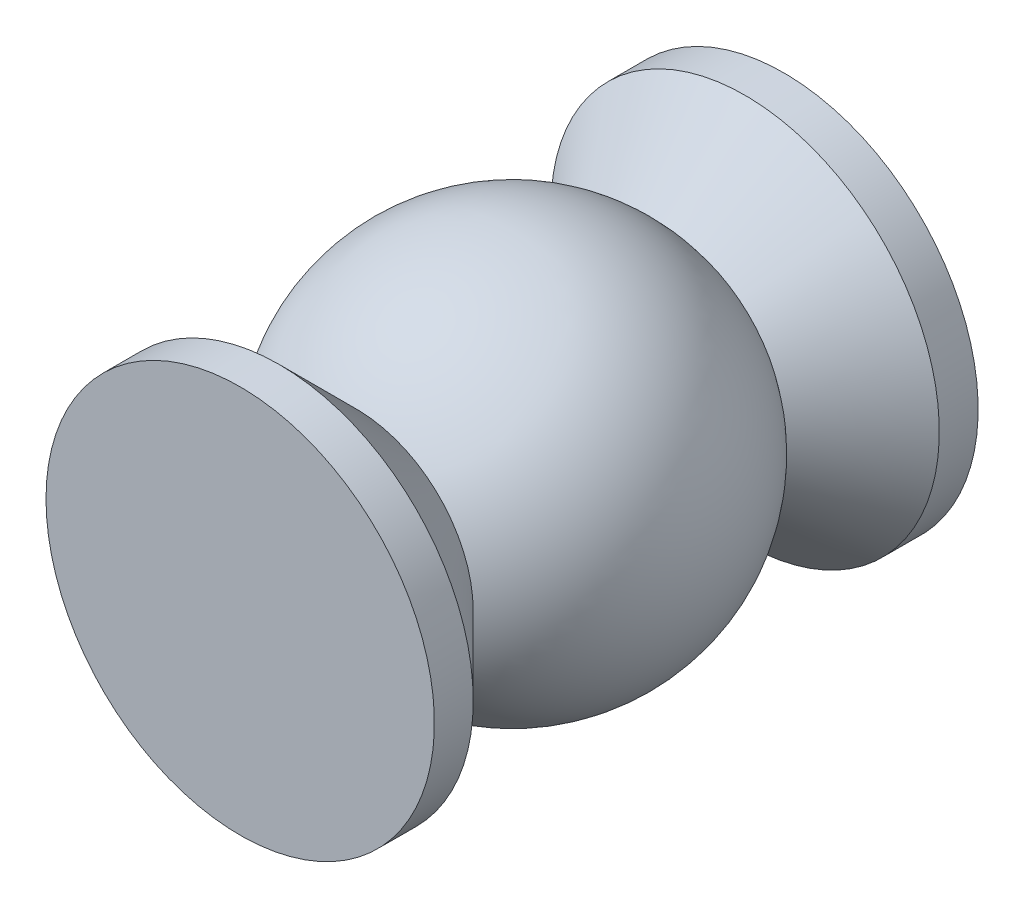
ISO-10303-21;
HEADER;
FILE_DESCRIPTION(('STEP AP214'),'2;1');
FILE_NAME('part.step','',(''),(''),'','','');
FILE_SCHEMA(('AUTOMOTIVE_DESIGN { 1 0 10303 214 1 1 1 1 }'));
ENDSEC;
DATA;
#1=APPLICATION_CONTEXT('core data for automotive mechanical design processes');
#2=APPLICATION_PROTOCOL_DEFINITION('international standard','automotive_design',2000,#1);
#3=PRODUCT_CONTEXT('',#1,'mechanical');
#4=PRODUCT('Part','Part','',(#3));
#5=PRODUCT_RELATED_PRODUCT_CATEGORY('part','',(#4));
#6=PRODUCT_DEFINITION_FORMATION('','',#4);
#7=PRODUCT_DEFINITION_CONTEXT('part definition',#1,'design');
#8=PRODUCT_DEFINITION('design','',#6,#7);
#9=PRODUCT_DEFINITION_SHAPE('','',#8);
#10=(LENGTH_UNIT() NAMED_UNIT(*) SI_UNIT(.MILLI.,.METRE.));
#11=(NAMED_UNIT(*) PLANE_ANGLE_UNIT() SI_UNIT($,.RADIAN.));
#12=(NAMED_UNIT(*) SI_UNIT($,.STERADIAN.) SOLID_ANGLE_UNIT());
#13=UNCERTAINTY_MEASURE_WITH_UNIT(LENGTH_MEASURE(1.E-05),#10,'distance_accuracy_value','');
#14=(GEOMETRIC_REPRESENTATION_CONTEXT(3) GLOBAL_UNCERTAINTY_ASSIGNED_CONTEXT((#13)) GLOBAL_UNIT_ASSIGNED_CONTEXT((#10,
#11,#12)) REPRESENTATION_CONTEXT('',''));
#15=CARTESIAN_POINT('',(0.,0.,0.));
#16=DIRECTION('',(0.,0.,1.));
#17=DIRECTION('',(1.,0.,0.));
#18=AXIS2_PLACEMENT_3D('',#15,#16,#17);
#19=CARTESIAN_POINT('',(0.,0.,-35.));
#20=DIRECTION('',(0.,0.,1.));
#21=DIRECTION('',(1.,0.,0.));
#22=AXIS2_PLACEMENT_3D('',#19,#20,#21);
#23=PLANE('',#22);
#24=CARTESIAN_POINT('',(0.,0.,-35.));
#25=DIRECTION('',(0.,0.,-1.));
#26=DIRECTION('',(-1.,0.,0.));
#27=AXIS2_PLACEMENT_3D('',#24,#25,#26);
#28=CIRCLE('',#27,25.);
#29=CARTESIAN_POINT('',(-25.,0.,-35.));
#30=VERTEX_POINT('',#29);
#31=EDGE_CURVE('E10',#30,#30,#28,.T.);
#32=ORIENTED_EDGE('',*,*,#31,.T.);
#33=EDGE_LOOP('',(#32));
#34=FACE_BOUND('',#33,.T.);
#35=ADVANCED_FACE('F39',(#34),#23,.F.);
#36=CARTESIAN_POINT('',(0.,0.,-35.));
#37=DIRECTION('',(0.,0.,-1.));
#38=DIRECTION('',(-1.,0.,0.));
#39=AXIS2_PLACEMENT_3D('',#36,#37,#38);
#40=CYLINDRICAL_SURFACE('',#39,25.);
#41=ORIENTED_EDGE('',*,*,#31,.F.);
#42=EDGE_LOOP('',(#41));
#43=FACE_BOUND('',#42,.T.);
#44=CARTESIAN_POINT('',(0.,0.,-30.));
#45=DIRECTION('',(0.,0.,-1.));
#46=DIRECTION('',(-1.,0.,0.));
#47=AXIS2_PLACEMENT_3D('',#44,#45,#46);
#48=CIRCLE('',#47,25.);
#49=CARTESIAN_POINT('',(-25.,0.,-30.));
#50=VERTEX_POINT('',#49);
#51=EDGE_CURVE('E45',#50,#50,#48,.T.);
#52=ORIENTED_EDGE('',*,*,#51,.T.);
#53=EDGE_LOOP('',(#52));
#54=FACE_BOUND('',#53,.T.);
#55=ADVANCED_FACE('F77',(#43,#54),#40,.T.);
#56=CARTESIAN_POINT('',(0.,0.,-20.));
#57=DIRECTION('',(0.,0.,-1.));
#58=DIRECTION('',(-1.,0.,0.));
#59=AXIS2_PLACEMENT_3D('',#56,#57,#58);
#60=CONICAL_SURFACE('',#59,15.,0.78539816339745);
#61=ORIENTED_EDGE('',*,*,#51,.F.);
#62=EDGE_LOOP('',(#61));
#63=FACE_BOUND('',#62,.T.);
#64=CARTESIAN_POINT('',(0.,0.,-20.));
#65=DIRECTION('',(0.,0.,-1.));
#66=DIRECTION('',(-1.,0.,0.));
#67=AXIS2_PLACEMENT_3D('',#64,#65,#66);
#68=CIRCLE('',#67,15.);
#69=CARTESIAN_POINT('',(15.,0.,-20.));
#70=VERTEX_POINT('',#69);
#71=EDGE_CURVE('E49',#70,#70,#68,.T.);
#72=ORIENTED_EDGE('',*,*,#71,.T.);
#73=EDGE_LOOP('',(#72));
#74=FACE_BOUND('',#73,.T.);
#75=ADVANCED_FACE('F81',(#63,#74),#60,.T.);
#76=CARTESIAN_POINT('',(0.,0.,0.));
#77=DIRECTION('',(0.,0.,-1.));
#78=DIRECTION('',(1.,0.,0.));
#79=AXIS2_PLACEMENT_3D('',#76,#77,#78);
#80=SPHERICAL_SURFACE('',#79,25.);
#81=CARTESIAN_POINT('',(0.,0.,20.));
#82=DIRECTION('',(0.,0.,-1.));
#83=DIRECTION('',(-1.,0.,0.));
#84=AXIS2_PLACEMENT_3D('',#81,#82,#83);
#85=CIRCLE('',#84,15.);
#86=CARTESIAN_POINT('',(15.,0.,20.));
#87=VERTEX_POINT('',#86);
#88=EDGE_CURVE('E53',#87,#87,#85,.T.);
#89=CARTESIAN_POINT('',(15.,0.,-20.));
#90=CARTESIAN_POINT('',(15.386383877575,0.,-19.7102331585328));
#91=CARTESIAN_POINT('',(15.764349304277,0.,-19.4092445387064));
#92=CARTESIAN_POINT('',(16.5022218904126,0.,-18.785891059142));
#93=CARTESIAN_POINT('',(16.8621290498462,0.,-18.4635261994041));
#94=CARTESIAN_POINT('',(17.5626637359227,0.,-17.7984875568239));
#95=CARTESIAN_POINT('',(17.9032912625655,0.,-17.4558137739817));
#96=CARTESIAN_POINT('',(18.5641263057405,0.,-16.751312031891));
#97=CARTESIAN_POINT('',(18.8843338222725,0.,-16.3894840726425));
#98=CARTESIAN_POINT('',(19.5032526836538,0.,-15.6478878896459));
#99=CARTESIAN_POINT('',(19.8019640285029,0.,-15.2681196658977));
#100=CARTESIAN_POINT('',(20.3768877346254,0.,-14.4919184892619));
#101=CARTESIAN_POINT('',(20.6531000958988,0.,-14.0954855363742));
#102=CARTESIAN_POINT('',(21.1820982609088,0.,-13.2872860261715));
#103=CARTESIAN_POINT('',(21.4348840646453,0.,-12.8755194688565));
#104=CARTESIAN_POINT('',(21.9161802896365,0.,-12.0380354631662));
#105=CARTESIAN_POINT('',(22.1446907108911,0.,-11.6123180147909));
#106=CARTESIAN_POINT('',(22.5766688391047,0.,-10.748361760207));
#107=CARTESIAN_POINT('',(22.7801365460637,0.,-10.3101229539983));
#108=CARTESIAN_POINT('',(23.1613460121235,0.,-9.42259557021362));
#109=CARTESIAN_POINT('',(23.3390877712243,0.,-8.97330699263761));
#110=CARTESIAN_POINT('',(23.6682484928968,0.,-8.06518875528101));
#111=CARTESIAN_POINT('',(23.8196674554685,0.,-7.60635909550044));
#112=CARTESIAN_POINT('',(24.0956741265362,0.,-6.6806994219065));
#113=CARTESIAN_POINT('',(24.2202618350321,0.,-6.21386940809315));
#114=CARTESIAN_POINT('',(24.4421876383544,0.,-5.27377661927491));
#115=CARTESIAN_POINT('',(24.5395257331807,0.,-4.80051384427002));
#116=CARTESIAN_POINT('',(24.706625452501,0.,-3.84914472685123));
#117=CARTESIAN_POINT('',(24.776387076995,0.,-3.37103838443732));
#118=CARTESIAN_POINT('',(24.8880995994487,0.,-2.41158759044098));
#119=CARTESIAN_POINT('',(24.9300504974084,0.,-1.93024313885855));
#120=CARTESIAN_POINT('',(24.986000697684,0.,-0.965932458184076));
#121=CARTESIAN_POINT('',(25.,0.,-0.482966229092036));
#122=CARTESIAN_POINT('',(25.,0.,0.482966229092047));
#123=CARTESIAN_POINT('',(24.986000697684,0.,0.965932458184088));
#124=CARTESIAN_POINT('',(24.9300504974084,0.,1.93024313885856));
#125=CARTESIAN_POINT('',(24.8880995994487,0.,2.41158759044099));
#126=CARTESIAN_POINT('',(24.776387076995,0.,3.37103838443733));
#127=CARTESIAN_POINT('',(24.706625452501,0.,3.84914472685124));
#128=CARTESIAN_POINT('',(24.5395257331807,0.,4.80051384427003));
#129=CARTESIAN_POINT('',(24.4421876383544,0.,5.27377661927492));
#130=CARTESIAN_POINT('',(24.2202618350321,0.,6.21386940809316));
#131=CARTESIAN_POINT('',(24.0956741265362,0.,6.68069942190651));
#132=CARTESIAN_POINT('',(23.8196674554685,0.,7.60635909550045));
#133=CARTESIAN_POINT('',(23.6682484928968,0.,8.06518875528102));
#134=CARTESIAN_POINT('',(23.3390877712243,0.,8.97330699263762));
#135=CARTESIAN_POINT('',(23.1613460121235,0.,9.42259557021363));
#136=CARTESIAN_POINT('',(22.7801365460637,0.,10.3101229539983));
#137=CARTESIAN_POINT('',(22.5766688391047,0.,10.748361760207));
#138=CARTESIAN_POINT('',(22.1446907108911,0.,11.6123180147909));
#139=CARTESIAN_POINT('',(21.9161802896365,0.,12.0380354631662));
#140=CARTESIAN_POINT('',(21.4348840646453,0.,12.8755194688565));
#141=CARTESIAN_POINT('',(21.1820982609087,0.,13.2872860261715));
#142=CARTESIAN_POINT('',(20.6531000958988,0.,14.0954855363742));
#143=CARTESIAN_POINT('',(20.3768877346254,0.,14.4919184892619));
#144=CARTESIAN_POINT('',(19.8019640285029,0.,15.2681196658977));
#145=CARTESIAN_POINT('',(19.5032526836538,0.,15.6478878896459));
#146=CARTESIAN_POINT('',(18.8843338222725,0.,16.3894840726425));
#147=CARTESIAN_POINT('',(18.5641263057405,0.,16.751312031891));
#148=CARTESIAN_POINT('',(17.9032912625655,0.,17.4558137739817));
#149=CARTESIAN_POINT('',(17.5626637359227,0.,17.798487556824));
#150=CARTESIAN_POINT('',(16.8621290498462,0.,18.4635261994041));
#151=CARTESIAN_POINT('',(16.5022218904126,0.,18.785891059142));
#152=CARTESIAN_POINT('',(15.764349304277,0.,19.4092445387064));
#153=CARTESIAN_POINT('',(15.386383877575,0.,19.7102331585329));
#154=CARTESIAN_POINT('',(15.,0.,20.));
#155=B_SPLINE_CURVE_WITH_KNOTS('',3,(#89,#90,#91,#92,#93,#94,#95,#96,#97,#98,#99,#100,#101,#102,
#103,#104,#105,#106,#107,#108,#109,#110,#111,#112,#113,#114,#115,#116,#117,#118,#119,#120,#121,
#122,#123,#124,#125,#126,#127,#128,#129,#130,#131,#132,#133,#134,#135,#136,#137,#138,#139,#140,
#141,#142,#143,#144,#145,#146,#147,#148,#149,#150,#151,#152,#153,#154),.UNSPECIFIED.,.F.,.F.,(4,
2,2,2,2,2,2,2,2,2,2,2,2,2,2,2,2,2,2,2,2,2,2,2,2,2,2,2,2,2,2,2,4),(0.,1.4486960076868,
2.8973920153736,4.34608802306039,5.79478403074719,7.24348003843399,8.69217604612079,
10.1408720538076,11.5895680614944,13.0382640691812,14.486960076868,15.9356560845548,
17.3843520922416,18.8330480999284,20.2817441076152,21.730440115302,23.1791361229888,
24.6278321306756,26.0765281383624,27.5252241460492,28.9739201537359,30.4226161614227,
31.8713121691095,33.3200081767963,34.7687041844831,36.2174001921699,37.6660961998567,
39.1147922075435,40.5634882152303,42.0121842229171,43.4608802306039,44.9095762382907,
46.3582722459775),.UNSPECIFIED.);
#156=EDGE_CURVE('BSEAM86',#70,#87,#155,.T.);
#157=ORIENTED_EDGE('',*,*,#71,.F.);
#158=ORIENTED_EDGE('',*,*,#88,.T.);
#159=ORIENTED_EDGE('',*,*,#156,.T.);
#160=ORIENTED_EDGE('',*,*,#156,.F.);
#161=EDGE_LOOP('',(#157,#159,#158,#160));
#162=FACE_BOUND('',#161,.T.);
#163=ADVANCED_FACE('F86',(#162),#80,.T.);
#164=CARTESIAN_POINT('',(0.,0.,30.));
#165=DIRECTION('',(0.,0.,1.));
#166=DIRECTION('',(1.,0.,0.));
#167=AXIS2_PLACEMENT_3D('',#164,#165,#166);
#168=CONICAL_SURFACE('',#167,25.,0.78539816339745);
#169=ORIENTED_EDGE('',*,*,#88,.F.);
#170=EDGE_LOOP('',(#169));
#171=FACE_BOUND('',#170,.T.);
#172=CARTESIAN_POINT('',(0.,0.,30.));
#173=DIRECTION('',(0.,0.,-1.));
#174=DIRECTION('',(-1.,0.,0.));
#175=AXIS2_PLACEMENT_3D('',#172,#173,#174);
#176=CIRCLE('',#175,25.);
#177=CARTESIAN_POINT('',(-25.,0.,30.));
#178=VERTEX_POINT('',#177);
#179=EDGE_CURVE('E58',#178,#178,#176,.T.);
#180=ORIENTED_EDGE('',*,*,#179,.T.);
#181=EDGE_LOOP('',(#180));
#182=FACE_BOUND('',#181,.T.);
#183=ADVANCED_FACE('F73',(#171,#182),#168,.T.);
#184=CARTESIAN_POINT('',(0.,0.,-35.));
#185=DIRECTION('',(0.,0.,-1.));
#186=DIRECTION('',(-1.,0.,0.));
#187=AXIS2_PLACEMENT_3D('',#184,#185,#186);
#188=CYLINDRICAL_SURFACE('',#187,25.);
#189=ORIENTED_EDGE('',*,*,#179,.F.);
#190=EDGE_LOOP('',(#189));
#191=FACE_BOUND('',#190,.T.);
#192=CARTESIAN_POINT('',(0.,0.,35.));
#193=DIRECTION('',(0.,0.,-1.));
#194=DIRECTION('',(-1.,0.,0.));
#195=AXIS2_PLACEMENT_3D('',#192,#193,#194);
#196=CIRCLE('',#195,25.);
#197=CARTESIAN_POINT('',(-25.,0.,35.));
#198=VERTEX_POINT('',#197);
#199=EDGE_CURVE('E61',#198,#198,#196,.T.);
#200=ORIENTED_EDGE('',*,*,#199,.T.);
#201=EDGE_LOOP('',(#200));
#202=FACE_BOUND('',#201,.T.);
#203=ADVANCED_FACE('F65',(#191,#202),#188,.T.);
#204=CARTESIAN_POINT('',(0.,0.,35.));
#205=DIRECTION('',(0.,0.,-1.));
#206=DIRECTION('',(-1.,0.,0.));
#207=AXIS2_PLACEMENT_3D('',#204,#205,#206);
#208=PLANE('',#207);
#209=ORIENTED_EDGE('',*,*,#199,.F.);
#210=EDGE_LOOP('',(#209));
#211=FACE_BOUND('',#210,.T.);
#212=ADVANCED_FACE('F67',(#211),#208,.F.);
#213=CLOSED_SHELL('',(#35,#55,#75,#163,#183,#203,#212));
#214=MANIFOLD_SOLID_BREP('B2',#213);
#215=ADVANCED_BREP_SHAPE_REPRESENTATION('',(#18,#214),#14);
#216=SHAPE_DEFINITION_REPRESENTATION(#9,#215);
ENDSEC;
END-ISO-10303-21;
